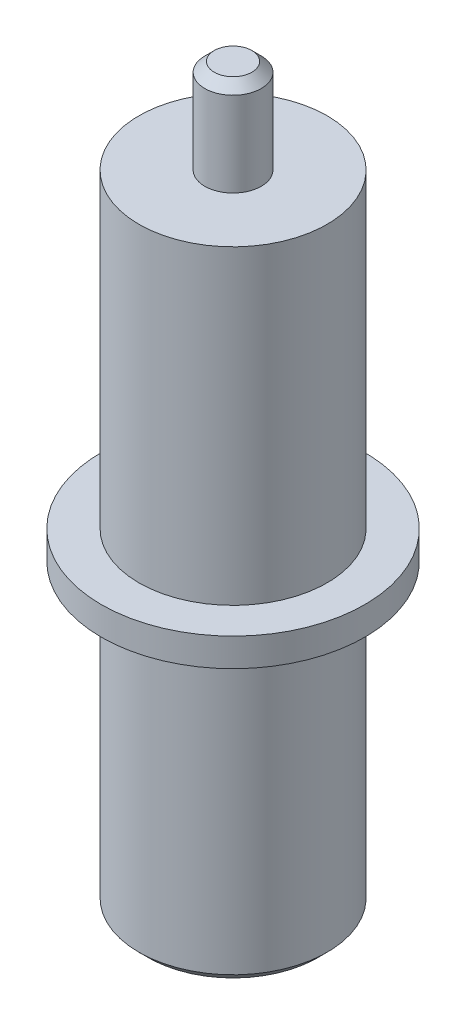
ISO-10303-21;
HEADER;
FILE_DESCRIPTION(('STEP AP214'),'2;1');
FILE_NAME('part.step','',(''),(''),'','','');
FILE_SCHEMA(('AUTOMOTIVE_DESIGN { 1 0 10303 214 1 1 1 1 }'));
ENDSEC;
DATA;
#1=APPLICATION_CONTEXT('core data for automotive mechanical design processes');
#2=APPLICATION_PROTOCOL_DEFINITION('international standard','automotive_design',2000,#1);
#3=PRODUCT_CONTEXT('',#1,'mechanical');
#4=PRODUCT('Part','Part','',(#3));
#5=PRODUCT_RELATED_PRODUCT_CATEGORY('part','',(#4));
#6=PRODUCT_DEFINITION_FORMATION('','',#4);
#7=PRODUCT_DEFINITION_CONTEXT('part definition',#1,'design');
#8=PRODUCT_DEFINITION('design','',#6,#7);
#9=PRODUCT_DEFINITION_SHAPE('','',#8);
#10=(LENGTH_UNIT() NAMED_UNIT(*) SI_UNIT(.MILLI.,.METRE.));
#11=(NAMED_UNIT(*) PLANE_ANGLE_UNIT() SI_UNIT($,.RADIAN.));
#12=(NAMED_UNIT(*) SI_UNIT($,.STERADIAN.) SOLID_ANGLE_UNIT());
#13=UNCERTAINTY_MEASURE_WITH_UNIT(LENGTH_MEASURE(1.E-05),#10,'distance_accuracy_value','');
#14=(GEOMETRIC_REPRESENTATION_CONTEXT(3) GLOBAL_UNCERTAINTY_ASSIGNED_CONTEXT((#13)) GLOBAL_UNIT_ASSIGNED_CONTEXT((#10,
#11,#12)) REPRESENTATION_CONTEXT('',''));
#15=CARTESIAN_POINT('',(0.,0.,0.));
#16=DIRECTION('',(0.,0.,1.));
#17=DIRECTION('',(1.,0.,0.));
#18=AXIS2_PLACEMENT_3D('',#15,#16,#17);
#19=CARTESIAN_POINT('',(-7.,16.,0.));
#20=DIRECTION('',(0.,-1.,0.));
#21=DIRECTION('',(0.,0.,-1.));
#22=AXIS2_PLACEMENT_3D('',#19,#20,#21);
#23=PLANE('',#22);
#24=CARTESIAN_POINT('',(0.,16.,0.));
#25=DIRECTION('',(0.,1.,0.));
#26=DIRECTION('',(0.,0.,1.));
#27=AXIS2_PLACEMENT_3D('',#24,#25,#26);
#28=CIRCLE('',#27,5.);
#29=CARTESIAN_POINT('',(0.,16.,5.));
#30=VERTEX_POINT('',#29);
#31=EDGE_CURVE('E71',#30,#30,#28,.T.);
#32=ORIENTED_EDGE('',*,*,#31,.T.);
#33=EDGE_LOOP('',(#32));
#34=FACE_BOUND('',#33,.T.);
#35=CARTESIAN_POINT('',(0.,16.,0.));
#36=DIRECTION('',(0.,1.,0.));
#37=DIRECTION('',(0.,0.,1.));
#38=AXIS2_PLACEMENT_3D('',#35,#36,#37);
#39=CIRCLE('',#38,7.);
#40=CARTESIAN_POINT('',(0.,16.,7.));
#41=VERTEX_POINT('',#40);
#42=EDGE_CURVE('E56',#41,#41,#39,.T.);
#43=ORIENTED_EDGE('',*,*,#42,.F.);
#44=EDGE_LOOP('',(#43));
#45=FACE_BOUND('',#44,.T.);
#46=ADVANCED_FACE('F35',(#34,#45),#23,.T.);
#47=CARTESIAN_POINT('',(0.,16.7146681838626,0.));
#48=DIRECTION('',(0.,1.,0.));
#49=DIRECTION('',(0.,0.,1.));
#50=AXIS2_PLACEMENT_3D('',#47,#48,#49);
#51=CYLINDRICAL_SURFACE('',#50,7.);
#52=ORIENTED_EDGE('',*,*,#42,.T.);
#53=EDGE_LOOP('',(#52));
#54=FACE_BOUND('',#53,.T.);
#55=CARTESIAN_POINT('',(0.,17.5,0.));
#56=DIRECTION('',(0.,1.,0.));
#57=DIRECTION('',(0.,0.,1.));
#58=AXIS2_PLACEMENT_3D('',#55,#56,#57);
#59=CIRCLE('',#58,7.);
#60=CARTESIAN_POINT('',(0.,17.5,7.));
#61=VERTEX_POINT('',#60);
#62=EDGE_CURVE('E59',#61,#61,#59,.T.);
#63=ORIENTED_EDGE('',*,*,#62,.F.);
#64=EDGE_LOOP('',(#63));
#65=FACE_BOUND('',#64,.T.);
#66=ADVANCED_FACE('F90',(#54,#65),#51,.T.);
#67=CARTESIAN_POINT('',(-7.,17.5,0.));
#68=DIRECTION('',(0.,1.,0.));
#69=DIRECTION('',(0.,0.,1.));
#70=AXIS2_PLACEMENT_3D('',#67,#68,#69);
#71=PLANE('',#70);
#72=ORIENTED_EDGE('',*,*,#62,.T.);
#73=EDGE_LOOP('',(#72));
#74=FACE_BOUND('',#73,.T.);
#75=CARTESIAN_POINT('',(0.,17.5,0.));
#76=DIRECTION('',(0.,1.,0.));
#77=DIRECTION('',(0.,0.,1.));
#78=AXIS2_PLACEMENT_3D('',#75,#76,#77);
#79=CIRCLE('',#78,5.);
#80=CARTESIAN_POINT('',(0.,17.5,5.));
#81=VERTEX_POINT('',#80);
#82=EDGE_CURVE('E62',#81,#81,#79,.T.);
#83=ORIENTED_EDGE('',*,*,#82,.F.);
#84=EDGE_LOOP('',(#83));
#85=FACE_BOUND('',#84,.T.);
#86=ADVANCED_FACE('F95',(#74,#85),#71,.T.);
#87=CARTESIAN_POINT('',(0.,16.7146681838626,0.));
#88=DIRECTION('',(0.,1.,0.));
#89=DIRECTION('',(0.,0.,1.));
#90=AXIS2_PLACEMENT_3D('',#87,#88,#89);
#91=CYLINDRICAL_SURFACE('',#90,5.);
#92=ORIENTED_EDGE('',*,*,#82,.T.);
#93=EDGE_LOOP('',(#92));
#94=FACE_BOUND('',#93,.T.);
#95=CARTESIAN_POINT('',(0.,34.0000000000001,0.));
#96=DIRECTION('',(0.,1.,0.));
#97=DIRECTION('',(0.,0.,1.));
#98=AXIS2_PLACEMENT_3D('',#95,#96,#97);
#99=CIRCLE('',#98,5.);
#100=CARTESIAN_POINT('',(0.,34.0000000000001,5.));
#101=VERTEX_POINT('',#100);
#102=EDGE_CURVE('E65',#101,#101,#99,.T.);
#103=ORIENTED_EDGE('',*,*,#102,.F.);
#104=EDGE_LOOP('',(#103));
#105=FACE_BOUND('',#104,.T.);
#106=ADVANCED_FACE('F106',(#94,#105),#91,.T.);
#107=CARTESIAN_POINT('',(-5.,34.0000000000001,0.));
#108=DIRECTION('',(0.,1.,0.));
#109=DIRECTION('',(0.,0.,1.));
#110=AXIS2_PLACEMENT_3D('',#107,#108,#109);
#111=PLANE('',#110);
#112=ORIENTED_EDGE('',*,*,#102,.T.);
#113=EDGE_LOOP('',(#112));
#114=FACE_BOUND('',#113,.T.);
#115=CARTESIAN_POINT('',(0.,34.0000000000001,0.));
#116=DIRECTION('',(0.,1.,0.));
#117=DIRECTION('',(0.,0.,1.));
#118=AXIS2_PLACEMENT_3D('',#115,#116,#117);
#119=CIRCLE('',#118,1.5);
#120=CARTESIAN_POINT('',(0.,34.0000000000001,1.5));
#121=VERTEX_POINT('',#120);
#122=EDGE_CURVE('E68',#121,#121,#119,.T.);
#123=ORIENTED_EDGE('',*,*,#122,.F.);
#124=EDGE_LOOP('',(#123));
#125=FACE_BOUND('',#124,.T.);
#126=ADVANCED_FACE('F110',(#114,#125),#111,.T.);
#127=CARTESIAN_POINT('',(0.,16.7146681838626,0.));
#128=DIRECTION('',(0.,1.,0.));
#129=DIRECTION('',(0.,0.,1.));
#130=AXIS2_PLACEMENT_3D('',#127,#128,#129);
#131=CYLINDRICAL_SURFACE('',#130,1.5);
#132=CARTESIAN_POINT('',(0.,38.5000000000001,0.));
#133=DIRECTION('',(0.,1.,0.));
#134=DIRECTION('',(0.,0.,1.));
#135=AXIS2_PLACEMENT_3D('',#132,#133,#134);
#136=CIRCLE('',#135,1.5);
#137=CARTESIAN_POINT('',(0.,38.5000000000001,1.5));
#138=VERTEX_POINT('',#137);
#139=EDGE_CURVE('E47',#138,#138,#136,.F.);
#140=ORIENTED_EDGE('',*,*,#139,.T.);
#141=EDGE_LOOP('',(#140));
#142=FACE_BOUND('',#141,.T.);
#143=ORIENTED_EDGE('',*,*,#122,.T.);
#144=EDGE_LOOP('',(#143));
#145=FACE_BOUND('',#144,.T.);
#146=ADVANCED_FACE('F114',(#142,#145),#131,.T.);
#147=CARTESIAN_POINT('',(-1.5,39.0000000000001,0.));
#148=DIRECTION('',(0.,1.,0.));
#149=DIRECTION('',(0.,0.,1.));
#150=AXIS2_PLACEMENT_3D('',#147,#148,#149);
#151=PLANE('',#150);
#152=CARTESIAN_POINT('',(0.,39.0000000000001,0.));
#153=DIRECTION('',(0.,1.,0.));
#154=DIRECTION('',(0.,0.,1.));
#155=AXIS2_PLACEMENT_3D('',#152,#153,#154);
#156=CIRCLE('',#155,0.999999999999994);
#157=CARTESIAN_POINT('',(0.,39.0000000000001,0.999999999999994));
#158=VERTEX_POINT('',#157);
#159=EDGE_CURVE('E51',#158,#158,#156,.T.);
#160=ORIENTED_EDGE('',*,*,#159,.T.);
#161=EDGE_LOOP('',(#160));
#162=FACE_BOUND('',#161,.T.);
#163=ADVANCED_FACE('F87',(#162),#151,.T.);
#164=CARTESIAN_POINT('',(-5.,0.,0.));
#165=DIRECTION('',(0.,-1.,0.));
#166=DIRECTION('',(0.,0.,-1.));
#167=AXIS2_PLACEMENT_3D('',#164,#165,#166);
#168=PLANE('',#167);
#169=CARTESIAN_POINT('',(0.,0.,0.));
#170=DIRECTION('',(0.,-1.,0.));
#171=DIRECTION('',(0.,0.,-1.));
#172=AXIS2_PLACEMENT_3D('',#169,#170,#171);
#173=CIRCLE('',#172,4.5);
#174=CARTESIAN_POINT('',(0.,0.,-4.5));
#175=VERTEX_POINT('',#174);
#176=EDGE_CURVE('E10',#175,#175,#173,.T.);
#177=ORIENTED_EDGE('',*,*,#176,.T.);
#178=EDGE_LOOP('',(#177));
#179=FACE_BOUND('',#178,.T.);
#180=ADVANCED_FACE('F80',(#179),#168,.T.);
#181=CARTESIAN_POINT('',(0.,16.7146681838626,0.));
#182=DIRECTION('',(0.,1.,0.));
#183=DIRECTION('',(0.,0.,1.));
#184=AXIS2_PLACEMENT_3D('',#181,#182,#183);
#185=CYLINDRICAL_SURFACE('',#184,5.);
#186=CARTESIAN_POINT('',(0.,0.499999999999997,0.));
#187=DIRECTION('',(0.,-1.,0.));
#188=DIRECTION('',(0.,0.,-1.));
#189=AXIS2_PLACEMENT_3D('',#186,#187,#188);
#190=CIRCLE('',#189,5.);
#191=CARTESIAN_POINT('',(0.,0.499999999999997,-5.));
#192=VERTEX_POINT('',#191);
#193=EDGE_CURVE('E43',#192,#192,#190,.F.);
#194=ORIENTED_EDGE('',*,*,#193,.T.);
#195=EDGE_LOOP('',(#194));
#196=FACE_BOUND('',#195,.T.);
#197=ORIENTED_EDGE('',*,*,#31,.F.);
#198=EDGE_LOOP('',(#197));
#199=FACE_BOUND('',#198,.T.);
#200=ADVANCED_FACE('F77',(#196,#199),#185,.T.);
#201=CARTESIAN_POINT('',(0.,39.0000000000001,0.));
#202=DIRECTION('',(0.,-1.,0.));
#203=DIRECTION('',(0.,0.,-1.));
#204=AXIS2_PLACEMENT_3D('',#201,#202,#203);
#205=CONICAL_SURFACE('',#204,0.999999999999994,0.785398163397451);
#206=ORIENTED_EDGE('',*,*,#139,.F.);
#207=EDGE_LOOP('',(#206));
#208=FACE_BOUND('',#207,.T.);
#209=ORIENTED_EDGE('',*,*,#159,.F.);
#210=EDGE_LOOP('',(#209));
#211=FACE_BOUND('',#210,.T.);
#212=ADVANCED_FACE('F79',(#208,#211),#205,.T.);
#213=CARTESIAN_POINT('',(0.,0.499999999999997,0.));
#214=DIRECTION('',(0.,1.,0.));
#215=DIRECTION('',(0.,0.,1.));
#216=AXIS2_PLACEMENT_3D('',#213,#214,#215);
#217=CONICAL_SURFACE('',#216,5.,0.785398163397453);
#218=ORIENTED_EDGE('',*,*,#176,.F.);
#219=EDGE_LOOP('',(#218));
#220=FACE_BOUND('',#219,.T.);
#221=ORIENTED_EDGE('',*,*,#193,.F.);
#222=EDGE_LOOP('',(#221));
#223=FACE_BOUND('',#222,.T.);
#224=ADVANCED_FACE('F38',(#220,#223),#217,.T.);
#225=CLOSED_SHELL('',(#46,#66,#86,#106,#126,#146,#163,#180,#200,#212,#224));
#226=MANIFOLD_SOLID_BREP('B2',#225);
#227=ADVANCED_BREP_SHAPE_REPRESENTATION('',(#18,#226),#14);
#228=SHAPE_DEFINITION_REPRESENTATION(#9,#227);
ENDSEC;
END-ISO-10303-21;
